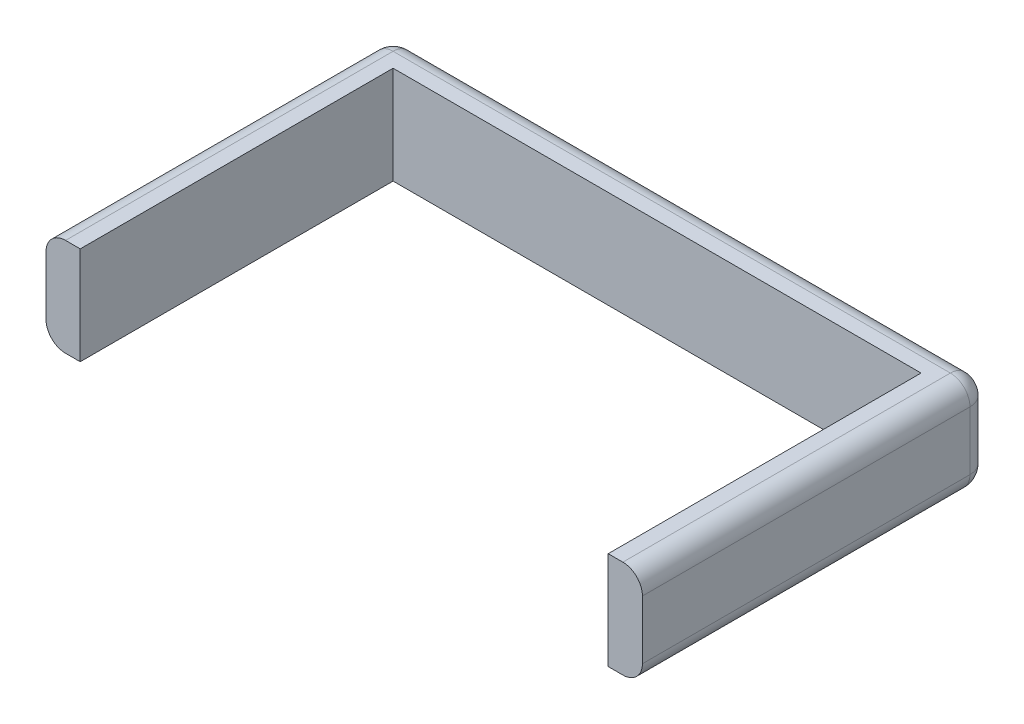
ISO-10303-21;
HEADER;
FILE_DESCRIPTION(('STEP AP214'),'2;1');
FILE_NAME('part.step','',(''),(''),'','','');
FILE_SCHEMA(('AUTOMOTIVE_DESIGN { 1 0 10303 214 1 1 1 1 }'));
ENDSEC;
DATA;
#1=APPLICATION_CONTEXT('core data for automotive mechanical design processes');
#2=APPLICATION_PROTOCOL_DEFINITION('international standard','automotive_design',2000,#1);
#3=PRODUCT_CONTEXT('',#1,'mechanical');
#4=PRODUCT('Part','Part','',(#3));
#5=PRODUCT_RELATED_PRODUCT_CATEGORY('part','',(#4));
#6=PRODUCT_DEFINITION_FORMATION('','',#4);
#7=PRODUCT_DEFINITION_CONTEXT('part definition',#1,'design');
#8=PRODUCT_DEFINITION('design','',#6,#7);
#9=PRODUCT_DEFINITION_SHAPE('','',#8);
#10=(LENGTH_UNIT() NAMED_UNIT(*) SI_UNIT(.MILLI.,.METRE.));
#11=(NAMED_UNIT(*) PLANE_ANGLE_UNIT() SI_UNIT($,.RADIAN.));
#12=(NAMED_UNIT(*) SI_UNIT($,.STERADIAN.) SOLID_ANGLE_UNIT());
#13=UNCERTAINTY_MEASURE_WITH_UNIT(LENGTH_MEASURE(1.E-05),#10,'distance_accuracy_value','');
#14=(GEOMETRIC_REPRESENTATION_CONTEXT(3) GLOBAL_UNCERTAINTY_ASSIGNED_CONTEXT((#13)) GLOBAL_UNIT_ASSIGNED_CONTEXT((#10,
#11,#12)) REPRESENTATION_CONTEXT('',''));
#15=CARTESIAN_POINT('',(0.,0.,0.));
#16=DIRECTION('',(0.,0.,1.));
#17=DIRECTION('',(1.,0.,0.));
#18=AXIS2_PLACEMENT_3D('',#15,#16,#17);
#19=CARTESIAN_POINT('',(342.9,127.,-2.04522138691604E-13));
#20=DIRECTION('',(1.,0.,0.));
#21=DIRECTION('',(0.,0.,-1.));
#22=AXIS2_PLACEMENT_3D('',#19,#20,#21);
#23=PLANE('',#22);
#24=DIRECTION('',(0.,0.,1.));
#25=VECTOR('',#24,1.);
#26=CARTESIAN_POINT('',(342.9,0.,-2.04522138691604E-13));
#27=LINE('',#26,#25);
#28=CARTESIAN_POINT('',(342.9,0.,-406.4));
#29=VERTEX_POINT('',#28);
#30=CARTESIAN_POINT('',(342.9,0.,-2.04522138691604E-13));
#31=VERTEX_POINT('',#30);
#32=EDGE_CURVE('E171',#29,#31,#27,.T.);
#33=ORIENTED_EDGE('',*,*,#32,.T.);
#34=DIRECTION('',(0.,-1.,0.));
#35=VECTOR('',#34,1.);
#36=CARTESIAN_POINT('',(342.9,127.,-2.04522138691604E-13));
#37=LINE('',#36,#35);
#38=CARTESIAN_POINT('',(342.9,127.,-2.04522138691604E-13));
#39=VERTEX_POINT('',#38);
#40=EDGE_CURVE('E149',#39,#31,#37,.T.);
#41=ORIENTED_EDGE('',*,*,#40,.F.);
#42=DIRECTION('',(0.,0.,1.));
#43=VECTOR('',#42,1.);
#44=CARTESIAN_POINT('',(342.9,127.,-2.04522138691604E-13));
#45=LINE('',#44,#43);
#46=CARTESIAN_POINT('',(342.9,127.,-406.4));
#47=VERTEX_POINT('',#46);
#48=EDGE_CURVE('E158',#47,#39,#45,.T.);
#49=ORIENTED_EDGE('',*,*,#48,.F.);
#50=DIRECTION('',(0.,-1.,0.));
#51=VECTOR('',#50,1.);
#52=CARTESIAN_POINT('',(342.9,127.,-406.4));
#53=LINE('',#52,#51);
#54=EDGE_CURVE('E298',#47,#29,#53,.T.);
#55=ORIENTED_EDGE('',*,*,#54,.T.);
#56=EDGE_LOOP('',(#33,#41,#49,#55));
#57=FACE_BOUND('',#56,.T.);
#58=ADVANCED_FACE('F41',(#57),#23,.F.);
#59=CARTESIAN_POINT('',(387.35,127.,0.));
#60=DIRECTION('',(0.,0.,-1.));
#61=DIRECTION('',(-1.,0.,0.));
#62=AXIS2_PLACEMENT_3D('',#59,#60,#61);
#63=PLANE('',#62);
#64=DIRECTION('',(1.,0.,0.));
#65=VECTOR('',#64,1.);
#66=CARTESIAN_POINT('',(387.35,0.,0.));
#67=LINE('',#66,#65);
#68=CARTESIAN_POINT('',(361.95,0.,0.));
#69=VERTEX_POINT('',#68);
#70=EDGE_CURVE('E283',#31,#69,#67,.T.);
#71=ORIENTED_EDGE('',*,*,#70,.T.);
#72=CARTESIAN_POINT('',(361.95,25.4,-1.11022302462516E-13));
#73=DIRECTION('',(0.,0.,-1.));
#74=DIRECTION('',(-1.,0.,0.));
#75=AXIS2_PLACEMENT_3D('',#72,#73,#74);
#76=CIRCLE('',#75,25.4);
#77=CARTESIAN_POINT('',(387.35,25.4,0.));
#78=VERTEX_POINT('',#77);
#79=EDGE_CURVE('E231',#69,#78,#76,.F.);
#80=ORIENTED_EDGE('',*,*,#79,.T.);
#81=DIRECTION('',(0.,-1.,0.));
#82=VECTOR('',#81,1.);
#83=CARTESIAN_POINT('',(387.35,127.,0.));
#84=LINE('',#83,#82);
#85=CARTESIAN_POINT('',(387.35,101.6,0.));
#86=VERTEX_POINT('',#85);
#87=EDGE_CURVE('E174',#86,#78,#84,.T.);
#88=ORIENTED_EDGE('',*,*,#87,.F.);
#89=CARTESIAN_POINT('',(361.95,101.6,0.));
#90=DIRECTION('',(0.,0.,-1.));
#91=DIRECTION('',(-1.,0.,0.));
#92=AXIS2_PLACEMENT_3D('',#89,#90,#91);
#93=CIRCLE('',#92,25.4);
#94=CARTESIAN_POINT('',(361.95,127.,0.));
#95=VERTEX_POINT('',#94);
#96=EDGE_CURVE('E153',#86,#95,#93,.F.);
#97=ORIENTED_EDGE('',*,*,#96,.T.);
#98=DIRECTION('',(1.,0.,0.));
#99=VECTOR('',#98,1.);
#100=CARTESIAN_POINT('',(387.35,127.,0.));
#101=LINE('',#100,#99);
#102=EDGE_CURVE('E144',#39,#95,#101,.T.);
#103=ORIENTED_EDGE('',*,*,#102,.F.);
#104=ORIENTED_EDGE('',*,*,#40,.T.);
#105=EDGE_LOOP('',(#71,#80,#88,#97,#103,#104));
#106=FACE_BOUND('',#105,.T.);
#107=ADVANCED_FACE('F147',(#106),#63,.F.);
#108=CARTESIAN_POINT('',(387.35,127.,-450.85));
#109=DIRECTION('',(-1.,0.,0.));
#110=DIRECTION('',(0.,0.,1.));
#111=AXIS2_PLACEMENT_3D('',#108,#109,#110);
#112=PLANE('',#111);
#113=ORIENTED_EDGE('',*,*,#87,.T.);
#114=DIRECTION('',(0.,0.,-1.));
#115=VECTOR('',#114,1.);
#116=CARTESIAN_POINT('',(387.35,25.4,-450.85));
#117=LINE('',#116,#115);
#118=CARTESIAN_POINT('',(387.35,25.4,-425.45));
#119=VERTEX_POINT('',#118);
#120=EDGE_CURVE('E201',#78,#119,#117,.T.);
#121=ORIENTED_EDGE('',*,*,#120,.T.);
#122=DIRECTION('',(0.,-1.,0.));
#123=VECTOR('',#122,1.);
#124=CARTESIAN_POINT('',(387.35,127.,-425.45));
#125=LINE('',#124,#123);
#126=CARTESIAN_POINT('',(387.35,101.6,-425.45));
#127=VERTEX_POINT('',#126);
#128=EDGE_CURVE('E197',#119,#127,#125,.F.);
#129=ORIENTED_EDGE('',*,*,#128,.T.);
#130=DIRECTION('',(0.,0.,-1.));
#131=VECTOR('',#130,1.);
#132=CARTESIAN_POINT('',(387.35,101.6,0.));
#133=LINE('',#132,#131);
#134=EDGE_CURVE('E194',#127,#86,#133,.F.);
#135=ORIENTED_EDGE('',*,*,#134,.T.);
#136=EDGE_LOOP('',(#113,#121,#129,#135));
#137=FACE_BOUND('',#136,.T.);
#138=ADVANCED_FACE('F343',(#137),#112,.F.);
#139=CARTESIAN_POINT('',(-387.35,127.,-450.85));
#140=DIRECTION('',(0.,0.,1.));
#141=DIRECTION('',(1.,0.,0.));
#142=AXIS2_PLACEMENT_3D('',#139,#140,#141);
#143=PLANE('',#142);
#144=DIRECTION('',(-1.,0.,0.));
#145=VECTOR('',#144,1.);
#146=CARTESIAN_POINT('',(387.35,101.6,-450.85));
#147=LINE('',#146,#145);
#148=CARTESIAN_POINT('',(-361.95,101.6,-450.85));
#149=VERTEX_POINT('',#148);
#150=CARTESIAN_POINT('',(361.95,101.6,-450.85));
#151=VERTEX_POINT('',#150);
#152=EDGE_CURVE('E187',#149,#151,#147,.F.);
#153=ORIENTED_EDGE('',*,*,#152,.T.);
#154=DIRECTION('',(0.,-1.,0.));
#155=VECTOR('',#154,1.);
#156=CARTESIAN_POINT('',(361.95,127.,-450.85));
#157=LINE('',#156,#155);
#158=CARTESIAN_POINT('',(361.95,25.4,-450.85));
#159=VERTEX_POINT('',#158);
#160=EDGE_CURVE('E190',#151,#159,#157,.T.);
#161=ORIENTED_EDGE('',*,*,#160,.T.);
#162=DIRECTION('',(-1.,0.,0.));
#163=VECTOR('',#162,1.);
#164=CARTESIAN_POINT('',(-387.35,25.4,-450.85));
#165=LINE('',#164,#163);
#166=CARTESIAN_POINT('',(-361.95,25.4,-450.85));
#167=VERTEX_POINT('',#166);
#168=EDGE_CURVE('E173',#159,#167,#165,.T.);
#169=ORIENTED_EDGE('',*,*,#168,.T.);
#170=DIRECTION('',(0.,-1.,0.));
#171=VECTOR('',#170,1.);
#172=CARTESIAN_POINT('',(-361.95,127.,-450.85));
#173=LINE('',#172,#171);
#174=EDGE_CURVE('E178',#167,#149,#173,.F.);
#175=ORIENTED_EDGE('',*,*,#174,.T.);
#176=EDGE_LOOP('',(#153,#161,#169,#175));
#177=FACE_BOUND('',#176,.T.);
#178=ADVANCED_FACE('F506',(#177),#143,.F.);
#179=CARTESIAN_POINT('',(-387.35,127.,-450.85));
#180=DIRECTION('',(1.,0.,0.));
#181=DIRECTION('',(0.,0.,-1.));
#182=AXIS2_PLACEMENT_3D('',#179,#180,#181);
#183=PLANE('',#182);
#184=DIRECTION('',(0.,-1.,0.));
#185=VECTOR('',#184,1.);
#186=CARTESIAN_POINT('',(-387.35,127.,-425.45));
#187=LINE('',#186,#185);
#188=CARTESIAN_POINT('',(-387.35,101.6,-425.45));
#189=VERTEX_POINT('',#188);
#190=CARTESIAN_POINT('',(-387.35,25.4,-425.45));
#191=VERTEX_POINT('',#190);
#192=EDGE_CURVE('E216',#189,#191,#187,.T.);
#193=ORIENTED_EDGE('',*,*,#192,.T.);
#194=DIRECTION('',(0.,0.,1.));
#195=VECTOR('',#194,1.);
#196=CARTESIAN_POINT('',(-387.35,25.4,-450.85));
#197=LINE('',#196,#195);
#198=CARTESIAN_POINT('',(-387.35,25.4,1.58640746361548E-13));
#199=VERTEX_POINT('',#198);
#200=EDGE_CURVE('E219',#191,#199,#197,.T.);
#201=ORIENTED_EDGE('',*,*,#200,.T.);
#202=DIRECTION('',(0.,-1.,0.));
#203=VECTOR('',#202,1.);
#204=CARTESIAN_POINT('',(-387.35,127.,1.58640746361548E-13));
#205=LINE('',#204,#203);
#206=CARTESIAN_POINT('',(-387.35,101.6,1.58640746361548E-13));
#207=VERTEX_POINT('',#206);
#208=EDGE_CURVE('E181',#207,#199,#205,.T.);
#209=ORIENTED_EDGE('',*,*,#208,.F.);
#210=DIRECTION('',(0.,0.,1.));
#211=VECTOR('',#210,1.);
#212=CARTESIAN_POINT('',(-387.35,101.6,-450.85));
#213=LINE('',#212,#211);
#214=EDGE_CURVE('E213',#207,#189,#213,.F.);
#215=ORIENTED_EDGE('',*,*,#214,.T.);
#216=EDGE_LOOP('',(#193,#201,#209,#215));
#217=FACE_BOUND('',#216,.T.);
#218=ADVANCED_FACE('F498',(#217),#183,.F.);
#219=CARTESIAN_POINT('',(-387.35,127.,1.58640746361548E-13));
#220=DIRECTION('',(0.,0.,-1.));
#221=DIRECTION('',(-1.,0.,0.));
#222=AXIS2_PLACEMENT_3D('',#219,#220,#221);
#223=PLANE('',#222);
#224=ORIENTED_EDGE('',*,*,#208,.T.);
#225=CARTESIAN_POINT('',(-361.95,25.4,0.));
#226=DIRECTION('',(0.,0.,-1.));
#227=DIRECTION('',(-1.,0.,0.));
#228=AXIS2_PLACEMENT_3D('',#225,#226,#227);
#229=CIRCLE('',#228,25.4);
#230=CARTESIAN_POINT('',(-361.95,0.,0.));
#231=VERTEX_POINT('',#230);
#232=EDGE_CURVE('E11',#199,#231,#229,.F.);
#233=ORIENTED_EDGE('',*,*,#232,.T.);
#234=DIRECTION('',(1.,0.,0.));
#235=VECTOR('',#234,1.);
#236=CARTESIAN_POINT('',(-387.35,0.,1.58640746361548E-13));
#237=LINE('',#236,#235);
#238=CARTESIAN_POINT('',(-342.9,0.,0.));
#239=VERTEX_POINT('',#238);
#240=EDGE_CURVE('E286',#231,#239,#237,.T.);
#241=ORIENTED_EDGE('',*,*,#240,.T.);
#242=DIRECTION('',(0.,-1.,0.));
#243=VECTOR('',#242,1.);
#244=CARTESIAN_POINT('',(-342.9,127.,0.));
#245=LINE('',#244,#243);
#246=CARTESIAN_POINT('',(-342.9,127.,0.));
#247=VERTEX_POINT('',#246);
#248=EDGE_CURVE('E305',#247,#239,#245,.T.);
#249=ORIENTED_EDGE('',*,*,#248,.F.);
#250=DIRECTION('',(1.,0.,0.));
#251=VECTOR('',#250,1.);
#252=CARTESIAN_POINT('',(-387.35,127.,1.58640746361548E-13));
#253=LINE('',#252,#251);
#254=CARTESIAN_POINT('',(-361.95,127.,0.));
#255=VERTEX_POINT('',#254);
#256=EDGE_CURVE('E157',#255,#247,#253,.T.);
#257=ORIENTED_EDGE('',*,*,#256,.F.);
#258=CARTESIAN_POINT('',(-361.95,101.6,0.));
#259=DIRECTION('',(0.,0.,-1.));
#260=DIRECTION('',(-1.,0.,0.));
#261=AXIS2_PLACEMENT_3D('',#258,#259,#260);
#262=CIRCLE('',#261,25.4);
#263=EDGE_CURVE('E51',#255,#207,#262,.F.);
#264=ORIENTED_EDGE('',*,*,#263,.T.);
#265=EDGE_LOOP('',(#224,#233,#241,#249,#257,#264));
#266=FACE_BOUND('',#265,.T.);
#267=ADVANCED_FACE('F313',(#266),#223,.F.);
#268=CARTESIAN_POINT('',(-342.9,127.,0.));
#269=DIRECTION('',(-1.,0.,0.));
#270=DIRECTION('',(0.,0.,1.));
#271=AXIS2_PLACEMENT_3D('',#268,#269,#270);
#272=PLANE('',#271);
#273=DIRECTION('',(0.,0.,-1.));
#274=VECTOR('',#273,1.);
#275=CARTESIAN_POINT('',(-342.9,0.,0.));
#276=LINE('',#275,#274);
#277=CARTESIAN_POINT('',(-342.9,0.,-406.4));
#278=VERTEX_POINT('',#277);
#279=EDGE_CURVE('E293',#239,#278,#276,.T.);
#280=ORIENTED_EDGE('',*,*,#279,.T.);
#281=DIRECTION('',(0.,-1.,0.));
#282=VECTOR('',#281,1.);
#283=CARTESIAN_POINT('',(-342.9,127.,-406.4));
#284=LINE('',#283,#282);
#285=CARTESIAN_POINT('',(-342.9,127.,-406.4));
#286=VERTEX_POINT('',#285);
#287=EDGE_CURVE('E301',#286,#278,#284,.T.);
#288=ORIENTED_EDGE('',*,*,#287,.F.);
#289=DIRECTION('',(0.,0.,-1.));
#290=VECTOR('',#289,1.);
#291=CARTESIAN_POINT('',(-342.9,127.,0.));
#292=LINE('',#291,#290);
#293=EDGE_CURVE('E547',#247,#286,#292,.T.);
#294=ORIENTED_EDGE('',*,*,#293,.F.);
#295=ORIENTED_EDGE('',*,*,#248,.T.);
#296=EDGE_LOOP('',(#280,#288,#294,#295));
#297=FACE_BOUND('',#296,.T.);
#298=ADVANCED_FACE('F481',(#297),#272,.F.);
#299=CARTESIAN_POINT('',(342.9,127.,-406.4));
#300=DIRECTION('',(0.,0.,-1.));
#301=DIRECTION('',(-1.,0.,0.));
#302=AXIS2_PLACEMENT_3D('',#299,#300,#301);
#303=PLANE('',#302);
#304=DIRECTION('',(1.,0.,0.));
#305=VECTOR('',#304,1.);
#306=CARTESIAN_POINT('',(342.9,0.,-406.4));
#307=LINE('',#306,#305);
#308=EDGE_CURVE('E168',#278,#29,#307,.T.);
#309=ORIENTED_EDGE('',*,*,#308,.T.);
#310=ORIENTED_EDGE('',*,*,#54,.F.);
#311=DIRECTION('',(1.,0.,0.));
#312=VECTOR('',#311,1.);
#313=CARTESIAN_POINT('',(342.9,127.,-406.4));
#314=LINE('',#313,#312);
#315=EDGE_CURVE('E163',#286,#47,#314,.T.);
#316=ORIENTED_EDGE('',*,*,#315,.F.);
#317=ORIENTED_EDGE('',*,*,#287,.T.);
#318=EDGE_LOOP('',(#309,#310,#316,#317));
#319=FACE_BOUND('',#318,.T.);
#320=ADVANCED_FACE('F472',(#319),#303,.F.);
#321=CARTESIAN_POINT('',(0.,127.,0.));
#322=DIRECTION('',(0.,1.,0.));
#323=DIRECTION('',(0.,0.,1.));
#324=AXIS2_PLACEMENT_3D('',#321,#322,#323);
#325=PLANE('',#324);
#326=ORIENTED_EDGE('',*,*,#102,.T.);
#327=DIRECTION('',(0.,0.,-1.));
#328=VECTOR('',#327,1.);
#329=CARTESIAN_POINT('',(361.95,127.,-450.85));
#330=LINE('',#329,#328);
#331=CARTESIAN_POINT('',(361.95,127.,-425.45));
#332=VERTEX_POINT('',#331);
#333=EDGE_CURVE('E210',#95,#332,#330,.T.);
#334=ORIENTED_EDGE('',*,*,#333,.T.);
#335=DIRECTION('',(-1.,0.,0.));
#336=VECTOR('',#335,1.);
#337=CARTESIAN_POINT('',(-387.35,127.,-425.45));
#338=LINE('',#337,#336);
#339=CARTESIAN_POINT('',(-361.95,127.,-425.45));
#340=VERTEX_POINT('',#339);
#341=EDGE_CURVE('E207',#332,#340,#338,.T.);
#342=ORIENTED_EDGE('',*,*,#341,.T.);
#343=DIRECTION('',(0.,0.,1.));
#344=VECTOR('',#343,1.);
#345=CARTESIAN_POINT('',(-361.95,127.,1.61768135163309E-13));
#346=LINE('',#345,#344);
#347=EDGE_CURVE('E204',#340,#255,#346,.T.);
#348=ORIENTED_EDGE('',*,*,#347,.T.);
#349=ORIENTED_EDGE('',*,*,#256,.T.);
#350=ORIENTED_EDGE('',*,*,#293,.T.);
#351=ORIENTED_EDGE('',*,*,#315,.T.);
#352=ORIENTED_EDGE('',*,*,#48,.T.);
#353=EDGE_LOOP('',(#326,#334,#342,#348,#349,#350,#351,#352));
#354=FACE_BOUND('',#353,.T.);
#355=ADVANCED_FACE('F161',(#354),#325,.T.);
#356=CARTESIAN_POINT('',(0.,0.,0.));
#357=DIRECTION('',(0.,1.,0.));
#358=DIRECTION('',(0.,0.,1.));
#359=AXIS2_PLACEMENT_3D('',#356,#357,#358);
#360=PLANE('',#359);
#361=DIRECTION('',(-1.,0.,0.));
#362=VECTOR('',#361,1.);
#363=CARTESIAN_POINT('',(0.,0.,-425.45));
#364=LINE('',#363,#362);
#365=CARTESIAN_POINT('',(-361.95,0.,-425.45));
#366=VERTEX_POINT('',#365);
#367=CARTESIAN_POINT('',(361.95,0.,-425.45));
#368=VERTEX_POINT('',#367);
#369=EDGE_CURVE('E59',#366,#368,#364,.F.);
#370=ORIENTED_EDGE('',*,*,#369,.T.);
#371=DIRECTION('',(0.,0.,-1.));
#372=VECTOR('',#371,1.);
#373=CARTESIAN_POINT('',(361.95,0.,-1.33695871275283E-13));
#374=LINE('',#373,#372);
#375=EDGE_CURVE('E226',#368,#69,#374,.F.);
#376=ORIENTED_EDGE('',*,*,#375,.T.);
#377=ORIENTED_EDGE('',*,*,#70,.F.);
#378=ORIENTED_EDGE('',*,*,#32,.F.);
#379=ORIENTED_EDGE('',*,*,#308,.F.);
#380=ORIENTED_EDGE('',*,*,#279,.F.);
#381=ORIENTED_EDGE('',*,*,#240,.F.);
#382=DIRECTION('',(0.,0.,1.));
#383=VECTOR('',#382,1.);
#384=CARTESIAN_POINT('',(-361.95,0.,0.));
#385=LINE('',#384,#383);
#386=EDGE_CURVE('E64',#231,#366,#385,.F.);
#387=ORIENTED_EDGE('',*,*,#386,.T.);
#388=EDGE_LOOP('',(#370,#376,#377,#378,#379,#380,#381,#387));
#389=FACE_BOUND('',#388,.T.);
#390=ADVANCED_FACE('F457',(#389),#360,.F.);
#391=CARTESIAN_POINT('',(-361.95,101.6,0.));
#392=DIRECTION('',(0.,0.,-1.));
#393=DIRECTION('',(-1.,0.,0.));
#394=AXIS2_PLACEMENT_3D('',#391,#392,#393);
#395=CYLINDRICAL_SURFACE('',#394,25.4);
#396=ORIENTED_EDGE('',*,*,#263,.F.);
#397=ORIENTED_EDGE('',*,*,#347,.F.);
#398=CARTESIAN_POINT('',(-361.95,101.6,-425.45));
#399=DIRECTION('',(0.,0.,-1.));
#400=DIRECTION('',(0.,1.,0.));
#401=AXIS2_PLACEMENT_3D('',#398,#399,#400);
#402=CIRCLE('',#401,25.4);
#403=EDGE_CURVE('E45',#189,#340,#402,.T.);
#404=ORIENTED_EDGE('',*,*,#403,.F.);
#405=ORIENTED_EDGE('',*,*,#214,.F.);
#406=EDGE_LOOP('',(#396,#397,#404,#405));
#407=FACE_BOUND('',#406,.T.);
#408=ADVANCED_FACE('F43',(#407),#395,.T.);
#409=CARTESIAN_POINT('',(-361.95,127.,-425.45));
#410=DIRECTION('',(0.,-1.,0.));
#411=DIRECTION('',(0.,0.,-1.));
#412=AXIS2_PLACEMENT_3D('',#409,#410,#411);
#413=CYLINDRICAL_SURFACE('',#412,25.4);
#414=CARTESIAN_POINT('',(-361.95,25.4,-425.45));
#415=DIRECTION('',(0.,-1.,0.));
#416=DIRECTION('',(0.,0.,-1.));
#417=AXIS2_PLACEMENT_3D('',#414,#415,#416);
#418=CIRCLE('',#417,25.4);
#419=EDGE_CURVE('E270',#191,#167,#418,.T.);
#420=ORIENTED_EDGE('',*,*,#419,.F.);
#421=ORIENTED_EDGE('',*,*,#192,.F.);
#422=CARTESIAN_POINT('',(-361.95,101.6,-425.45));
#423=DIRECTION('',(0.,1.,0.));
#424=DIRECTION('',(0.,0.,1.));
#425=AXIS2_PLACEMENT_3D('',#422,#423,#424);
#426=CIRCLE('',#425,25.4);
#427=EDGE_CURVE('E273',#149,#189,#426,.T.);
#428=ORIENTED_EDGE('',*,*,#427,.F.);
#429=ORIENTED_EDGE('',*,*,#174,.F.);
#430=EDGE_LOOP('',(#420,#421,#428,#429));
#431=FACE_BOUND('',#430,.T.);
#432=ADVANCED_FACE('F362',(#431),#413,.T.);
#433=CARTESIAN_POINT('',(-361.95,25.4,-450.85));
#434=DIRECTION('',(0.,0.,1.));
#435=DIRECTION('',(1.,0.,0.));
#436=AXIS2_PLACEMENT_3D('',#433,#434,#435);
#437=CYLINDRICAL_SURFACE('',#436,25.4);
#438=ORIENTED_EDGE('',*,*,#232,.F.);
#439=ORIENTED_EDGE('',*,*,#200,.F.);
#440=CARTESIAN_POINT('',(-361.95,25.4,-425.45));
#441=DIRECTION('',(0.,0.,-1.));
#442=DIRECTION('',(-1.,0.,0.));
#443=AXIS2_PLACEMENT_3D('',#440,#441,#442);
#444=CIRCLE('',#443,25.4);
#445=EDGE_CURVE('E266',#366,#191,#444,.T.);
#446=ORIENTED_EDGE('',*,*,#445,.F.);
#447=ORIENTED_EDGE('',*,*,#386,.F.);
#448=EDGE_LOOP('',(#438,#439,#446,#447));
#449=FACE_BOUND('',#448,.T.);
#450=ADVANCED_FACE('F320',(#449),#437,.T.);
#451=CARTESIAN_POINT('',(-361.95,101.6,-425.45));
#452=DIRECTION('',(0.,0.,1.));
#453=DIRECTION('',(1.,0.,0.));
#454=AXIS2_PLACEMENT_3D('',#451,#452,#453);
#455=SPHERICAL_SURFACE('',#454,25.4);
#456=ORIENTED_EDGE('',*,*,#427,.T.);
#457=ORIENTED_EDGE('',*,*,#403,.T.);
#458=CARTESIAN_POINT('',(-361.95,101.6,-425.45));
#459=DIRECTION('',(-1.,0.,0.));
#460=DIRECTION('',(0.,0.,1.));
#461=AXIS2_PLACEMENT_3D('',#458,#459,#460);
#462=CIRCLE('',#461,25.4);
#463=EDGE_CURVE('E262',#149,#340,#462,.F.);
#464=ORIENTED_EDGE('',*,*,#463,.F.);
#465=EDGE_LOOP('',(#456,#457,#464));
#466=FACE_BOUND('',#465,.T.);
#467=ADVANCED_FACE('F354',(#466),#455,.T.);
#468=CARTESIAN_POINT('',(-361.95,25.4,-425.45));
#469=DIRECTION('',(0.,0.,1.));
#470=DIRECTION('',(1.,0.,0.));
#471=AXIS2_PLACEMENT_3D('',#468,#469,#470);
#472=SPHERICAL_SURFACE('',#471,25.4);
#473=ORIENTED_EDGE('',*,*,#445,.T.);
#474=ORIENTED_EDGE('',*,*,#419,.T.);
#475=CARTESIAN_POINT('',(-361.95,25.4,-425.45));
#476=DIRECTION('',(-1.,0.,0.));
#477=DIRECTION('',(0.,0.,1.));
#478=AXIS2_PLACEMENT_3D('',#475,#476,#477);
#479=CIRCLE('',#478,25.4);
#480=EDGE_CURVE('E258',#366,#167,#479,.F.);
#481=ORIENTED_EDGE('',*,*,#480,.F.);
#482=EDGE_LOOP('',(#473,#474,#481));
#483=FACE_BOUND('',#482,.T.);
#484=ADVANCED_FACE('F324',(#483),#472,.T.);
#485=CARTESIAN_POINT('',(361.95,101.6,-1.33695871275283E-13));
#486=DIRECTION('',(0.,0.,1.));
#487=DIRECTION('',(1.,0.,0.));
#488=AXIS2_PLACEMENT_3D('',#485,#486,#487);
#489=CYLINDRICAL_SURFACE('',#488,25.4);
#490=ORIENTED_EDGE('',*,*,#96,.F.);
#491=ORIENTED_EDGE('',*,*,#134,.F.);
#492=CARTESIAN_POINT('',(361.95,101.6,-425.45));
#493=DIRECTION('',(0.,0.,-1.));
#494=DIRECTION('',(-1.,0.,0.));
#495=AXIS2_PLACEMENT_3D('',#492,#493,#494);
#496=CIRCLE('',#495,25.4);
#497=EDGE_CURVE('E254',#332,#127,#496,.T.);
#498=ORIENTED_EDGE('',*,*,#497,.F.);
#499=ORIENTED_EDGE('',*,*,#333,.F.);
#500=EDGE_LOOP('',(#490,#491,#498,#499));
#501=FACE_BOUND('',#500,.T.);
#502=ADVANCED_FACE('F346',(#501),#489,.T.);
#503=CARTESIAN_POINT('',(0.,101.6,-425.45));
#504=DIRECTION('',(1.,0.,0.));
#505=DIRECTION('',(0.,0.,-1.));
#506=AXIS2_PLACEMENT_3D('',#503,#504,#505);
#507=CYLINDRICAL_SURFACE('',#506,25.4);
#508=ORIENTED_EDGE('',*,*,#463,.T.);
#509=ORIENTED_EDGE('',*,*,#341,.F.);
#510=CARTESIAN_POINT('',(361.95,101.6,-425.45));
#511=DIRECTION('',(1.,0.,0.));
#512=DIRECTION('',(0.,0.,-1.));
#513=AXIS2_PLACEMENT_3D('',#510,#511,#512);
#514=CIRCLE('',#513,25.4);
#515=EDGE_CURVE('E250',#151,#332,#514,.T.);
#516=ORIENTED_EDGE('',*,*,#515,.F.);
#517=ORIENTED_EDGE('',*,*,#152,.F.);
#518=EDGE_LOOP('',(#508,#509,#516,#517));
#519=FACE_BOUND('',#518,.T.);
#520=ADVANCED_FACE('F352',(#519),#507,.T.);
#521=CARTESIAN_POINT('',(-387.35,25.4,-425.45));
#522=DIRECTION('',(-1.,0.,0.));
#523=DIRECTION('',(0.,0.,1.));
#524=AXIS2_PLACEMENT_3D('',#521,#522,#523);
#525=CYLINDRICAL_SURFACE('',#524,25.4);
#526=ORIENTED_EDGE('',*,*,#480,.T.);
#527=ORIENTED_EDGE('',*,*,#168,.F.);
#528=CARTESIAN_POINT('',(361.95,25.4,-425.45));
#529=DIRECTION('',(1.,0.,0.));
#530=DIRECTION('',(0.,0.,-1.));
#531=AXIS2_PLACEMENT_3D('',#528,#529,#530);
#532=CIRCLE('',#531,25.4);
#533=EDGE_CURVE('E246',#368,#159,#532,.T.);
#534=ORIENTED_EDGE('',*,*,#533,.F.);
#535=ORIENTED_EDGE('',*,*,#369,.F.);
#536=EDGE_LOOP('',(#526,#527,#534,#535));
#537=FACE_BOUND('',#536,.T.);
#538=ADVANCED_FACE('F328',(#537),#525,.T.);
#539=CARTESIAN_POINT('',(361.95,25.4,-450.85));
#540=DIRECTION('',(0.,0.,-1.));
#541=DIRECTION('',(-1.,0.,0.));
#542=AXIS2_PLACEMENT_3D('',#539,#540,#541);
#543=CYLINDRICAL_SURFACE('',#542,25.4);
#544=ORIENTED_EDGE('',*,*,#79,.F.);
#545=ORIENTED_EDGE('',*,*,#375,.F.);
#546=CARTESIAN_POINT('',(361.95,25.4,-425.45));
#547=DIRECTION('',(0.,0.,-1.));
#548=DIRECTION('',(-1.,0.,0.));
#549=AXIS2_PLACEMENT_3D('',#546,#547,#548);
#550=CIRCLE('',#549,25.4);
#551=EDGE_CURVE('E242',#119,#368,#550,.T.);
#552=ORIENTED_EDGE('',*,*,#551,.F.);
#553=ORIENTED_EDGE('',*,*,#120,.F.);
#554=EDGE_LOOP('',(#544,#545,#552,#553));
#555=FACE_BOUND('',#554,.T.);
#556=ADVANCED_FACE('F337',(#555),#543,.T.);
#557=CARTESIAN_POINT('',(361.95,101.6,-425.45));
#558=DIRECTION('',(0.,0.,1.));
#559=DIRECTION('',(1.,0.,0.));
#560=AXIS2_PLACEMENT_3D('',#557,#558,#559);
#561=SPHERICAL_SURFACE('',#560,25.4);
#562=ORIENTED_EDGE('',*,*,#515,.T.);
#563=ORIENTED_EDGE('',*,*,#497,.T.);
#564=CARTESIAN_POINT('',(361.95,101.6,-425.45));
#565=DIRECTION('',(0.,1.,0.));
#566=DIRECTION('',(0.,0.,1.));
#567=AXIS2_PLACEMENT_3D('',#564,#565,#566);
#568=CIRCLE('',#567,25.4);
#569=EDGE_CURVE('E239',#151,#127,#568,.F.);
#570=ORIENTED_EDGE('',*,*,#569,.F.);
#571=EDGE_LOOP('',(#562,#563,#570));
#572=FACE_BOUND('',#571,.T.);
#573=ADVANCED_FACE('F376',(#572),#561,.T.);
#574=CARTESIAN_POINT('',(361.95,25.4,-425.45));
#575=DIRECTION('',(0.,0.,1.));
#576=DIRECTION('',(1.,0.,0.));
#577=AXIS2_PLACEMENT_3D('',#574,#575,#576);
#578=SPHERICAL_SURFACE('',#577,25.4);
#579=ORIENTED_EDGE('',*,*,#551,.T.);
#580=ORIENTED_EDGE('',*,*,#533,.T.);
#581=CARTESIAN_POINT('',(361.95,25.4,-425.45));
#582=DIRECTION('',(0.,-1.,0.));
#583=DIRECTION('',(0.,0.,-1.));
#584=AXIS2_PLACEMENT_3D('',#581,#582,#583);
#585=CIRCLE('',#584,25.4);
#586=EDGE_CURVE('E236',#119,#159,#585,.F.);
#587=ORIENTED_EDGE('',*,*,#586,.F.);
#588=EDGE_LOOP('',(#579,#580,#587));
#589=FACE_BOUND('',#588,.T.);
#590=ADVANCED_FACE('F332',(#589),#578,.T.);
#591=CARTESIAN_POINT('',(361.95,127.,-425.45));
#592=DIRECTION('',(0.,-1.,0.));
#593=DIRECTION('',(0.,0.,-1.));
#594=AXIS2_PLACEMENT_3D('',#591,#592,#593);
#595=CYLINDRICAL_SURFACE('',#594,25.4);
#596=ORIENTED_EDGE('',*,*,#569,.T.);
#597=ORIENTED_EDGE('',*,*,#128,.F.);
#598=ORIENTED_EDGE('',*,*,#586,.T.);
#599=ORIENTED_EDGE('',*,*,#160,.F.);
#600=EDGE_LOOP('',(#596,#597,#598,#599));
#601=FACE_BOUND('',#600,.T.);
#602=ADVANCED_FACE('F339',(#601),#595,.T.);
#603=CLOSED_SHELL('',(#58,#107,#138,#178,#218,#267,#298,#320,#355,#390,#408,#432,#450,#467,#484,
#502,#520,#538,#556,#573,#590,#602));
#604=MANIFOLD_SOLID_BREP('B2',#603);
#605=ADVANCED_BREP_SHAPE_REPRESENTATION('',(#18,#604),#14);
#606=SHAPE_DEFINITION_REPRESENTATION(#9,#605);
ENDSEC;
END-ISO-10303-21;
